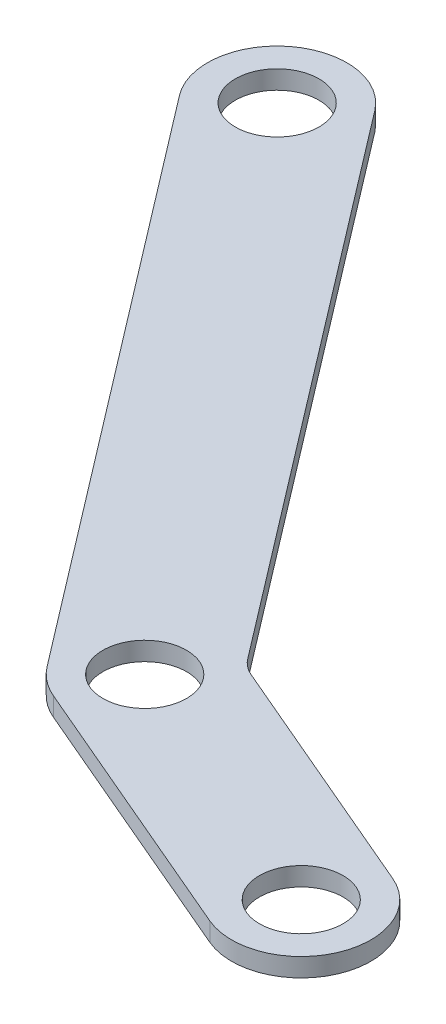
ISO-10303-21;
HEADER;
FILE_DESCRIPTION(('STEP AP214'),'2;1');
FILE_NAME('part.step','',(''),(''),'','','');
FILE_SCHEMA(('AUTOMOTIVE_DESIGN { 1 0 10303 214 1 1 1 1 }'));
ENDSEC;
DATA;
#1=APPLICATION_CONTEXT('core data for automotive mechanical design processes');
#2=APPLICATION_PROTOCOL_DEFINITION('international standard','automotive_design',2000,#1);
#3=PRODUCT_CONTEXT('',#1,'mechanical');
#4=PRODUCT('Part','Part','',(#3));
#5=PRODUCT_RELATED_PRODUCT_CATEGORY('part','',(#4));
#6=PRODUCT_DEFINITION_FORMATION('','',#4);
#7=PRODUCT_DEFINITION_CONTEXT('part definition',#1,'design');
#8=PRODUCT_DEFINITION('design','',#6,#7);
#9=PRODUCT_DEFINITION_SHAPE('','',#8);
#10=(LENGTH_UNIT() NAMED_UNIT(*) SI_UNIT(.MILLI.,.METRE.));
#11=(NAMED_UNIT(*) PLANE_ANGLE_UNIT() SI_UNIT($,.RADIAN.));
#12=(NAMED_UNIT(*) SI_UNIT($,.STERADIAN.) SOLID_ANGLE_UNIT());
#13=UNCERTAINTY_MEASURE_WITH_UNIT(LENGTH_MEASURE(1.E-05),#10,'distance_accuracy_value','');
#14=(GEOMETRIC_REPRESENTATION_CONTEXT(3) GLOBAL_UNCERTAINTY_ASSIGNED_CONTEXT((#13)) GLOBAL_UNIT_ASSIGNED_CONTEXT((#10,
#11,#12)) REPRESENTATION_CONTEXT('',''));
#15=CARTESIAN_POINT('',(0.,0.,0.));
#16=DIRECTION('',(0.,0.,1.));
#17=DIRECTION('',(1.,0.,0.));
#18=AXIS2_PLACEMENT_3D('',#15,#16,#17);
#19=CARTESIAN_POINT('',(679.45,6.35,-1098.55));
#20=DIRECTION('',(0.,1.,0.));
#21=DIRECTION('',(0.,0.,1.));
#22=AXIS2_PLACEMENT_3D('',#19,#20,#21);
#23=PLANE('',#22);
#24=CARTESIAN_POINT('',(586.027048678261,6.35,-1138.48384737708));
#25=DIRECTION('',(0.,1.,0.));
#26=DIRECTION('',(0.,0.,1.));
#27=AXIS2_PLACEMENT_3D('',#24,#25,#26);
#28=CIRCLE('',#27,14.2875);
#29=CARTESIAN_POINT('',(586.027048678261,6.35,-1124.19634737708));
#30=VERTEX_POINT('',#29);
#31=EDGE_CURVE('E297',#30,#30,#28,.T.);
#32=ORIENTED_EDGE('',*,*,#31,.F.);
#33=EDGE_LOOP('',(#32));
#34=FACE_BOUND('',#33,.T.);
#35=DIRECTION('',(-0.919517237418691,0.,-0.393049678908276));
#36=VECTOR('',#35,1.);
#37=CARTESIAN_POINT('',(601.146536188944,6.35,-1157.91773024678));
#38=LINE('',#37,#36);
#39=CARTESIAN_POINT('',(688.809495479003,6.35,-1120.44600421603));
#40=VERTEX_POINT('',#39);
#41=CARTESIAN_POINT('',(604.218531939174,6.35,-1156.60459886208));
#42=VERTEX_POINT('',#41);
#43=EDGE_CURVE('E109',#40,#42,#38,.T.);
#44=ORIENTED_EDGE('',*,*,#43,.T.);
#45=CARTESIAN_POINT('',(609.210262861309,6.35,-1168.28246777729));
#46=DIRECTION('',(0.,1.,0.));
#47=DIRECTION('',(0.,0.,1.));
#48=AXIS2_PLACEMENT_3D('',#45,#46,#47);
#49=CIRCLE('',#48,12.7);
#50=CARTESIAN_POINT('',(599.118347810659,6.35,-1160.57252286112));
#51=VERTEX_POINT('',#50);
#52=EDGE_CURVE('E11',#42,#51,#49,.F.);
#53=ORIENTED_EDGE('',*,*,#52,.T.);
#54=DIRECTION('',(-0.607082276864171,0.,-0.794638980366187));
#55=VECTOR('',#54,1.);
#56=CARTESIAN_POINT('',(458.460435990906,6.35,-1344.68638005727));
#57=LINE('',#56,#55);
#58=CARTESIAN_POINT('',(458.460435990906,6.35,-1344.68638005727));
#59=VERTEX_POINT('',#58);
#60=EDGE_CURVE('E99',#51,#59,#57,.T.);
#61=ORIENTED_EDGE('',*,*,#60,.T.);
#62=CARTESIAN_POINT('',(439.538095270937,6.35,-1330.23023333944));
#63=DIRECTION('',(0.,1.,0.));
#64=DIRECTION('',(0.,0.,1.));
#65=AXIS2_PLACEMENT_3D('',#62,#63,#64);
#66=CIRCLE('',#65,23.8124999999999);
#67=CARTESIAN_POINT('',(420.615754550967,6.35,-1315.77408662161));
#68=VERTEX_POINT('',#67);
#69=EDGE_CURVE('E103',#59,#68,#66,.T.);
#70=ORIENTED_EDGE('',*,*,#69,.T.);
#71=DIRECTION('',(0.607082276864171,0.,0.794638980366187));
#72=VECTOR('',#71,1.);
#73=CARTESIAN_POINT('',(420.615754550967,6.35,-1315.77408662161));
#74=LINE('',#73,#72);
#75=CARTESIAN_POINT('',(567.104707958291,6.35,-1124.02770065925));
#76=VERTEX_POINT('',#75);
#77=EDGE_CURVE('E123',#68,#76,#74,.T.);
#78=ORIENTED_EDGE('',*,*,#77,.T.);
#79=CARTESIAN_POINT('',(586.027048678261,6.35,-1138.48384737708));
#80=DIRECTION('',(0.,1.,0.));
#81=DIRECTION('',(0.,0.,1.));
#82=AXIS2_PLACEMENT_3D('',#79,#80,#81);
#83=CIRCLE('',#82,23.8124999999999);
#84=CARTESIAN_POINT('',(576.667553199258,6.35,-1116.58784316105));
#85=VERTEX_POINT('',#84);
#86=EDGE_CURVE('E125',#76,#85,#83,.T.);
#87=ORIENTED_EDGE('',*,*,#86,.T.);
#88=DIRECTION('',(0.91951723741869,0.,0.393049678908277));
#89=VECTOR('',#88,1.);
#90=CARTESIAN_POINT('',(576.667553199258,6.35,-1116.58784316105));
#91=LINE('',#90,#89);
#92=CARTESIAN_POINT('',(670.090504520997,6.35,-1076.65399578397));
#93=VERTEX_POINT('',#92);
#94=EDGE_CURVE('E130',#85,#93,#91,.T.);
#95=ORIENTED_EDGE('',*,*,#94,.T.);
#96=CARTESIAN_POINT('',(679.45,6.35,-1098.55));
#97=DIRECTION('',(0.,1.,0.));
#98=DIRECTION('',(0.,0.,1.));
#99=AXIS2_PLACEMENT_3D('',#96,#97,#98);
#100=CIRCLE('',#99,23.8125000000001);
#101=EDGE_CURVE('E132',#93,#40,#100,.T.);
#102=ORIENTED_EDGE('',*,*,#101,.T.);
#103=EDGE_LOOP('',(#44,#53,#61,#70,#78,#87,#95,#102));
#104=FACE_BOUND('',#103,.T.);
#105=CARTESIAN_POINT('',(439.538095270937,6.35,-1330.23023333944));
#106=DIRECTION('',(0.,1.,0.));
#107=DIRECTION('',(0.,0.,1.));
#108=AXIS2_PLACEMENT_3D('',#105,#106,#107);
#109=CIRCLE('',#108,14.2875);
#110=CARTESIAN_POINT('',(439.538095270937,6.35,-1315.94273333944));
#111=VERTEX_POINT('',#110);
#112=EDGE_CURVE('E137',#111,#111,#109,.T.);
#113=ORIENTED_EDGE('',*,*,#112,.F.);
#114=EDGE_LOOP('',(#113));
#115=FACE_BOUND('',#114,.T.);
#116=CARTESIAN_POINT('',(679.45,6.35,-1098.55));
#117=DIRECTION('',(0.,1.,0.));
#118=DIRECTION('',(0.,0.,1.));
#119=AXIS2_PLACEMENT_3D('',#116,#117,#118);
#120=CIRCLE('',#119,14.2875);
#121=CARTESIAN_POINT('',(679.45,6.35,-1084.2625));
#122=VERTEX_POINT('',#121);
#123=EDGE_CURVE('E302',#122,#122,#120,.T.);
#124=ORIENTED_EDGE('',*,*,#123,.F.);
#125=EDGE_LOOP('',(#124));
#126=FACE_BOUND('',#125,.T.);
#127=ADVANCED_FACE('F35',(#34,#104,#115,#126),#23,.T.);
#128=CARTESIAN_POINT('',(679.45,0.,-1098.55));
#129=DIRECTION('',(0.,1.,0.));
#130=DIRECTION('',(0.,0.,1.));
#131=AXIS2_PLACEMENT_3D('',#128,#129,#130);
#132=PLANE('',#131);
#133=DIRECTION('',(-0.919517237418691,0.,-0.393049678908276));
#134=VECTOR('',#133,1.);
#135=CARTESIAN_POINT('',(601.146536188944,0.,-1157.91773024678));
#136=LINE('',#135,#134);
#137=CARTESIAN_POINT('',(688.809495479003,0.,-1120.44600421603));
#138=VERTEX_POINT('',#137);
#139=CARTESIAN_POINT('',(604.218531939174,0.,-1156.60459886208));
#140=VERTEX_POINT('',#139);
#141=EDGE_CURVE('E135',#138,#140,#136,.T.);
#142=ORIENTED_EDGE('',*,*,#141,.F.);
#143=CARTESIAN_POINT('',(679.45,0.,-1098.55));
#144=DIRECTION('',(0.,1.,0.));
#145=DIRECTION('',(0.,0.,1.));
#146=AXIS2_PLACEMENT_3D('',#143,#144,#145);
#147=CIRCLE('',#146,23.8125000000001);
#148=CARTESIAN_POINT('',(670.090504520997,0.,-1076.65399578397));
#149=VERTEX_POINT('',#148);
#150=EDGE_CURVE('E147',#149,#138,#147,.T.);
#151=ORIENTED_EDGE('',*,*,#150,.F.);
#152=DIRECTION('',(0.91951723741869,0.,0.393049678908277));
#153=VECTOR('',#152,1.);
#154=CARTESIAN_POINT('',(576.667553199258,0.,-1116.58784316105));
#155=LINE('',#154,#153);
#156=CARTESIAN_POINT('',(576.667553199258,0.,-1116.58784316105));
#157=VERTEX_POINT('',#156);
#158=EDGE_CURVE('E145',#157,#149,#155,.T.);
#159=ORIENTED_EDGE('',*,*,#158,.F.);
#160=CARTESIAN_POINT('',(586.027048678261,0.,-1138.48384737708));
#161=DIRECTION('',(0.,1.,0.));
#162=DIRECTION('',(0.,0.,1.));
#163=AXIS2_PLACEMENT_3D('',#160,#161,#162);
#164=CIRCLE('',#163,23.8124999999999);
#165=CARTESIAN_POINT('',(567.104707958291,0.,-1124.02770065925));
#166=VERTEX_POINT('',#165);
#167=EDGE_CURVE('E143',#166,#157,#164,.T.);
#168=ORIENTED_EDGE('',*,*,#167,.F.);
#169=DIRECTION('',(0.607082276864171,0.,0.794638980366187));
#170=VECTOR('',#169,1.);
#171=CARTESIAN_POINT('',(420.615754550967,0.,-1315.77408662161));
#172=LINE('',#171,#170);
#173=CARTESIAN_POINT('',(420.615754550967,0.,-1315.77408662161));
#174=VERTEX_POINT('',#173);
#175=EDGE_CURVE('E141',#174,#166,#172,.T.);
#176=ORIENTED_EDGE('',*,*,#175,.F.);
#177=CARTESIAN_POINT('',(439.538095270937,0.,-1330.23023333944));
#178=DIRECTION('',(0.,1.,0.));
#179=DIRECTION('',(0.,0.,1.));
#180=AXIS2_PLACEMENT_3D('',#177,#178,#179);
#181=CIRCLE('',#180,23.8124999999999);
#182=CARTESIAN_POINT('',(458.460435990906,0.,-1344.68638005727));
#183=VERTEX_POINT('',#182);
#184=EDGE_CURVE('E139',#183,#174,#181,.T.);
#185=ORIENTED_EDGE('',*,*,#184,.F.);
#186=DIRECTION('',(-0.607082276864171,0.,-0.794638980366187));
#187=VECTOR('',#186,1.);
#188=CARTESIAN_POINT('',(458.460435990906,0.,-1344.68638005727));
#189=LINE('',#188,#187);
#190=CARTESIAN_POINT('',(599.118347810659,0.,-1160.57252286112));
#191=VERTEX_POINT('',#190);
#192=EDGE_CURVE('E114',#191,#183,#189,.T.);
#193=ORIENTED_EDGE('',*,*,#192,.F.);
#194=CARTESIAN_POINT('',(609.210262861309,0.,-1168.28246777729));
#195=DIRECTION('',(0.,1.,0.));
#196=DIRECTION('',(0.,0.,1.));
#197=AXIS2_PLACEMENT_3D('',#194,#195,#196);
#198=CIRCLE('',#197,12.7);
#199=EDGE_CURVE('E43',#191,#140,#198,.T.);
#200=ORIENTED_EDGE('',*,*,#199,.T.);
#201=EDGE_LOOP('',(#142,#151,#159,#168,#176,#185,#193,#200));
#202=FACE_BOUND('',#201,.T.);
#203=CARTESIAN_POINT('',(439.538095270937,0.,-1330.23023333944));
#204=DIRECTION('',(0.,1.,0.));
#205=DIRECTION('',(0.,0.,1.));
#206=AXIS2_PLACEMENT_3D('',#203,#204,#205);
#207=CIRCLE('',#206,14.2875);
#208=CARTESIAN_POINT('',(439.538095270937,0.,-1315.94273333944));
#209=VERTEX_POINT('',#208);
#210=EDGE_CURVE('E304',#209,#209,#207,.T.);
#211=ORIENTED_EDGE('',*,*,#210,.T.);
#212=EDGE_LOOP('',(#211));
#213=FACE_BOUND('',#212,.T.);
#214=CARTESIAN_POINT('',(586.027048678261,0.,-1138.48384737708));
#215=DIRECTION('',(0.,1.,0.));
#216=DIRECTION('',(0.,0.,1.));
#217=AXIS2_PLACEMENT_3D('',#214,#215,#216);
#218=CIRCLE('',#217,14.2875);
#219=CARTESIAN_POINT('',(586.027048678261,0.,-1124.19634737708));
#220=VERTEX_POINT('',#219);
#221=EDGE_CURVE('E300',#220,#220,#218,.T.);
#222=ORIENTED_EDGE('',*,*,#221,.T.);
#223=EDGE_LOOP('',(#222));
#224=FACE_BOUND('',#223,.T.);
#225=CARTESIAN_POINT('',(679.45,0.,-1098.55));
#226=DIRECTION('',(0.,1.,0.));
#227=DIRECTION('',(0.,0.,1.));
#228=AXIS2_PLACEMENT_3D('',#225,#226,#227);
#229=CIRCLE('',#228,14.2875);
#230=CARTESIAN_POINT('',(679.45,0.,-1084.2625));
#231=VERTEX_POINT('',#230);
#232=EDGE_CURVE('E307',#231,#231,#229,.T.);
#233=ORIENTED_EDGE('',*,*,#232,.T.);
#234=EDGE_LOOP('',(#233));
#235=FACE_BOUND('',#234,.T.);
#236=ADVANCED_FACE('F163',(#202,#213,#224,#235),#132,.F.);
#237=CARTESIAN_POINT('',(601.146536188944,6.35,-1157.91773024678));
#238=DIRECTION('',(-0.393049678908276,0.,0.919517237418691));
#239=DIRECTION('',(0.919517237418691,0.,0.393049678908276));
#240=AXIS2_PLACEMENT_3D('',#237,#238,#239);
#241=PLANE('',#240);
#242=ORIENTED_EDGE('',*,*,#141,.T.);
#243=DIRECTION('',(0.,-1.,0.));
#244=VECTOR('',#243,1.);
#245=CARTESIAN_POINT('',(604.218531939174,6.35,-1156.60459886208));
#246=LINE('',#245,#244);
#247=EDGE_CURVE('E50',#140,#42,#246,.F.);
#248=ORIENTED_EDGE('',*,*,#247,.T.);
#249=ORIENTED_EDGE('',*,*,#43,.F.);
#250=DIRECTION('',(0.,-1.,0.));
#251=VECTOR('',#250,1.);
#252=CARTESIAN_POINT('',(688.809495479003,6.35,-1120.44600421603));
#253=LINE('',#252,#251);
#254=EDGE_CURVE('E134',#40,#138,#253,.T.);
#255=ORIENTED_EDGE('',*,*,#254,.T.);
#256=EDGE_LOOP('',(#242,#248,#249,#255));
#257=FACE_BOUND('',#256,.T.);
#258=ADVANCED_FACE('F198',(#257),#241,.F.);
#259=CARTESIAN_POINT('',(458.460435990906,6.35,-1344.68638005727));
#260=DIRECTION('',(-0.794638980366187,0.,0.607082276864171));
#261=DIRECTION('',(0.607082276864171,0.,0.794638980366187));
#262=AXIS2_PLACEMENT_3D('',#259,#260,#261);
#263=PLANE('',#262);
#264=ORIENTED_EDGE('',*,*,#60,.F.);
#265=DIRECTION('',(0.,-1.,0.));
#266=VECTOR('',#265,1.);
#267=CARTESIAN_POINT('',(599.118347810659,0.,-1160.57252286112));
#268=LINE('',#267,#266);
#269=EDGE_CURVE('E117',#51,#191,#268,.T.);
#270=ORIENTED_EDGE('',*,*,#269,.T.);
#271=ORIENTED_EDGE('',*,*,#192,.T.);
#272=DIRECTION('',(0.,-1.,0.));
#273=VECTOR('',#272,1.);
#274=CARTESIAN_POINT('',(458.460435990906,6.35,-1344.68638005727));
#275=LINE('',#274,#273);
#276=EDGE_CURVE('E112',#59,#183,#275,.T.);
#277=ORIENTED_EDGE('',*,*,#276,.F.);
#278=EDGE_LOOP('',(#264,#270,#271,#277));
#279=FACE_BOUND('',#278,.T.);
#280=ADVANCED_FACE('F113',(#279),#263,.F.);
#281=CARTESIAN_POINT('',(439.538095270937,6.35,-1330.23023333944));
#282=DIRECTION('',(0.,-1.,0.));
#283=DIRECTION('',(0.,0.,-1.));
#284=AXIS2_PLACEMENT_3D('',#281,#282,#283);
#285=CYLINDRICAL_SURFACE('',#284,23.8124999999999);
#286=ORIENTED_EDGE('',*,*,#184,.T.);
#287=DIRECTION('',(0.,-1.,0.));
#288=VECTOR('',#287,1.);
#289=CARTESIAN_POINT('',(420.615754550967,6.35,-1315.77408662161));
#290=LINE('',#289,#288);
#291=EDGE_CURVE('E118',#68,#174,#290,.T.);
#292=ORIENTED_EDGE('',*,*,#291,.F.);
#293=ORIENTED_EDGE('',*,*,#69,.F.);
#294=ORIENTED_EDGE('',*,*,#276,.T.);
#295=EDGE_LOOP('',(#286,#292,#293,#294));
#296=FACE_BOUND('',#295,.T.);
#297=ADVANCED_FACE('F120',(#296),#285,.T.);
#298=CARTESIAN_POINT('',(420.615754550967,6.35,-1315.77408662161));
#299=DIRECTION('',(0.794638980366187,0.,-0.607082276864171));
#300=DIRECTION('',(-0.607082276864171,0.,-0.794638980366187));
#301=AXIS2_PLACEMENT_3D('',#298,#299,#300);
#302=PLANE('',#301);
#303=ORIENTED_EDGE('',*,*,#175,.T.);
#304=DIRECTION('',(0.,-1.,0.));
#305=VECTOR('',#304,1.);
#306=CARTESIAN_POINT('',(567.104707958291,6.35,-1124.02770065925));
#307=LINE('',#306,#305);
#308=EDGE_CURVE('E157',#76,#166,#307,.T.);
#309=ORIENTED_EDGE('',*,*,#308,.F.);
#310=ORIENTED_EDGE('',*,*,#77,.F.);
#311=ORIENTED_EDGE('',*,*,#291,.T.);
#312=EDGE_LOOP('',(#303,#309,#310,#311));
#313=FACE_BOUND('',#312,.T.);
#314=ADVANCED_FACE('F168',(#313),#302,.F.);
#315=CARTESIAN_POINT('',(586.027048678261,6.35,-1138.48384737708));
#316=DIRECTION('',(0.,-1.,0.));
#317=DIRECTION('',(0.,0.,-1.));
#318=AXIS2_PLACEMENT_3D('',#315,#316,#317);
#319=CYLINDRICAL_SURFACE('',#318,23.8124999999999);
#320=ORIENTED_EDGE('',*,*,#167,.T.);
#321=DIRECTION('',(0.,-1.,0.));
#322=VECTOR('',#321,1.);
#323=CARTESIAN_POINT('',(576.667553199258,6.35,-1116.58784316105));
#324=LINE('',#323,#322);
#325=EDGE_CURVE('E154',#85,#157,#324,.T.);
#326=ORIENTED_EDGE('',*,*,#325,.F.);
#327=ORIENTED_EDGE('',*,*,#86,.F.);
#328=ORIENTED_EDGE('',*,*,#308,.T.);
#329=EDGE_LOOP('',(#320,#326,#327,#328));
#330=FACE_BOUND('',#329,.T.);
#331=ADVANCED_FACE('F175',(#330),#319,.T.);
#332=CARTESIAN_POINT('',(576.667553199258,6.35,-1116.58784316105));
#333=DIRECTION('',(0.393049678908277,0.,-0.91951723741869));
#334=DIRECTION('',(-0.919517237418691,0.,-0.393049678908277));
#335=AXIS2_PLACEMENT_3D('',#332,#333,#334);
#336=PLANE('',#335);
#337=ORIENTED_EDGE('',*,*,#158,.T.);
#338=DIRECTION('',(0.,-1.,0.));
#339=VECTOR('',#338,1.);
#340=CARTESIAN_POINT('',(670.090504520997,6.35,-1076.65399578397));
#341=LINE('',#340,#339);
#342=EDGE_CURVE('E151',#93,#149,#341,.T.);
#343=ORIENTED_EDGE('',*,*,#342,.F.);
#344=ORIENTED_EDGE('',*,*,#94,.F.);
#345=ORIENTED_EDGE('',*,*,#325,.T.);
#346=EDGE_LOOP('',(#337,#343,#344,#345));
#347=FACE_BOUND('',#346,.T.);
#348=ADVANCED_FACE('F178',(#347),#336,.F.);
#349=CARTESIAN_POINT('',(679.45,6.35,-1098.55));
#350=DIRECTION('',(0.,-1.,0.));
#351=DIRECTION('',(0.,0.,-1.));
#352=AXIS2_PLACEMENT_3D('',#349,#350,#351);
#353=CYLINDRICAL_SURFACE('',#352,23.8125000000001);
#354=ORIENTED_EDGE('',*,*,#150,.T.);
#355=ORIENTED_EDGE('',*,*,#254,.F.);
#356=ORIENTED_EDGE('',*,*,#101,.F.);
#357=ORIENTED_EDGE('',*,*,#342,.T.);
#358=EDGE_LOOP('',(#354,#355,#356,#357));
#359=FACE_BOUND('',#358,.T.);
#360=ADVANCED_FACE('F183',(#359),#353,.T.);
#361=CARTESIAN_POINT('',(439.538095270937,6.35,-1330.23023333944));
#362=DIRECTION('',(0.,-1.,0.));
#363=DIRECTION('',(0.,0.,-1.));
#364=AXIS2_PLACEMENT_3D('',#361,#362,#363);
#365=CYLINDRICAL_SURFACE('',#364,14.2875);
#366=ORIENTED_EDGE('',*,*,#112,.T.);
#367=EDGE_LOOP('',(#366));
#368=FACE_BOUND('',#367,.T.);
#369=ORIENTED_EDGE('',*,*,#210,.F.);
#370=EDGE_LOOP('',(#369));
#371=FACE_BOUND('',#370,.T.);
#372=ADVANCED_FACE('F202',(#368,#371),#365,.F.);
#373=CARTESIAN_POINT('',(586.027048678261,6.35,-1138.48384737708));
#374=DIRECTION('',(0.,-1.,0.));
#375=DIRECTION('',(0.,0.,-1.));
#376=AXIS2_PLACEMENT_3D('',#373,#374,#375);
#377=CYLINDRICAL_SURFACE('',#376,14.2875);
#378=ORIENTED_EDGE('',*,*,#31,.T.);
#379=EDGE_LOOP('',(#378));
#380=FACE_BOUND('',#379,.T.);
#381=ORIENTED_EDGE('',*,*,#221,.F.);
#382=EDGE_LOOP('',(#381));
#383=FACE_BOUND('',#382,.T.);
#384=ADVANCED_FACE('F189',(#380,#383),#377,.F.);
#385=CARTESIAN_POINT('',(679.45,6.35,-1098.55));
#386=DIRECTION('',(0.,-1.,0.));
#387=DIRECTION('',(0.,0.,-1.));
#388=AXIS2_PLACEMENT_3D('',#385,#386,#387);
#389=CYLINDRICAL_SURFACE('',#388,14.2875);
#390=ORIENTED_EDGE('',*,*,#123,.T.);
#391=EDGE_LOOP('',(#390));
#392=FACE_BOUND('',#391,.T.);
#393=ORIENTED_EDGE('',*,*,#232,.F.);
#394=EDGE_LOOP('',(#393));
#395=FACE_BOUND('',#394,.T.);
#396=ADVANCED_FACE('F185',(#392,#395),#389,.F.);
#397=CARTESIAN_POINT('',(609.210262861309,6.35,-1168.28246777729));
#398=DIRECTION('',(0.,1.,0.));
#399=DIRECTION('',(0.,0.,1.));
#400=AXIS2_PLACEMENT_3D('',#397,#398,#399);
#401=CYLINDRICAL_SURFACE('',#400,12.7);
#402=ORIENTED_EDGE('',*,*,#52,.F.);
#403=ORIENTED_EDGE('',*,*,#247,.F.);
#404=ORIENTED_EDGE('',*,*,#199,.F.);
#405=ORIENTED_EDGE('',*,*,#269,.F.);
#406=EDGE_LOOP('',(#402,#403,#404,#405));
#407=FACE_BOUND('',#406,.T.);
#408=ADVANCED_FACE('F37',(#407),#401,.F.);
#409=CLOSED_SHELL('',(#127,#236,#258,#280,#297,#314,#331,#348,#360,#372,#384,#396,#408));
#410=MANIFOLD_SOLID_BREP('B2',#409);
#411=ADVANCED_BREP_SHAPE_REPRESENTATION('',(#18,#410),#14);
#412=SHAPE_DEFINITION_REPRESENTATION(#9,#411);
ENDSEC;
END-ISO-10303-21;
